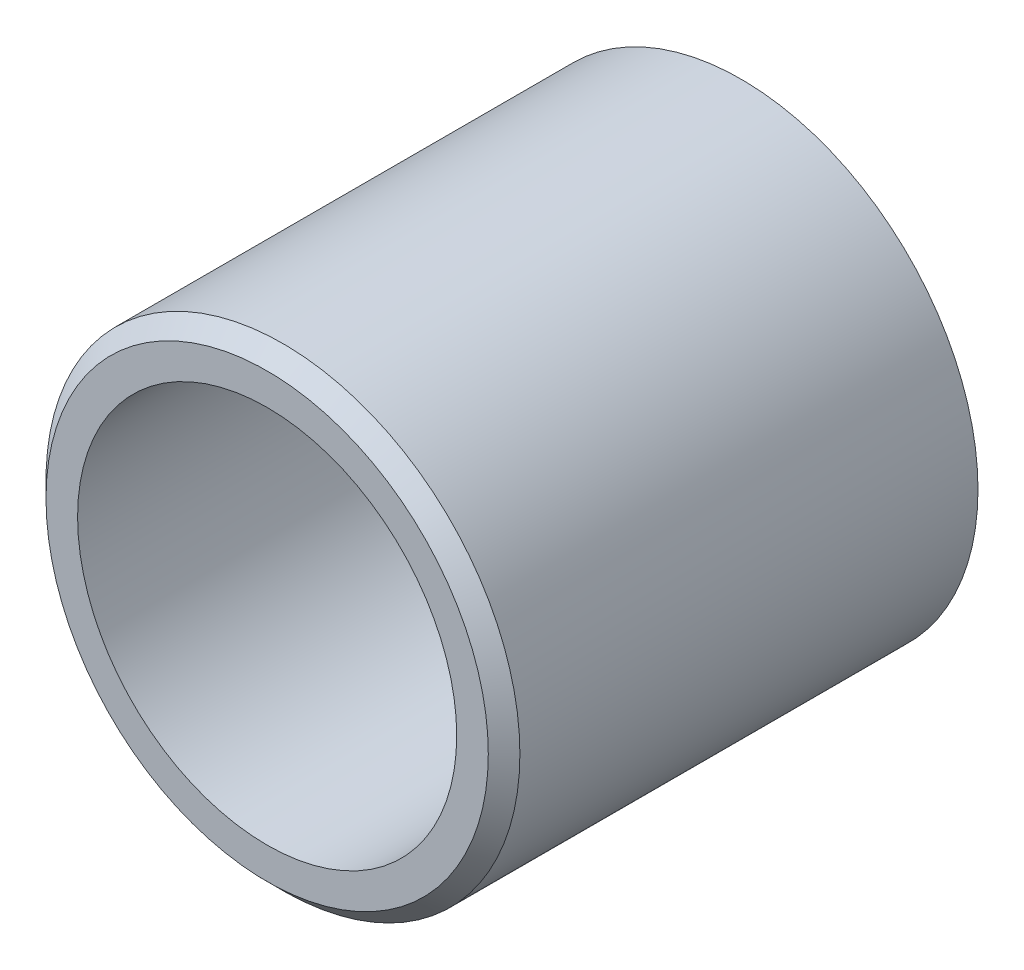
ISO-10303-21;
HEADER;
FILE_DESCRIPTION(('STEP AP214'),'2;1');
FILE_NAME('part.step','',(''),(''),'','','');
FILE_SCHEMA(('AUTOMOTIVE_DESIGN { 1 0 10303 214 1 1 1 1 }'));
ENDSEC;
DATA;
#1=APPLICATION_CONTEXT('core data for automotive mechanical design processes');
#2=APPLICATION_PROTOCOL_DEFINITION('international standard','automotive_design',2000,#1);
#3=PRODUCT_CONTEXT('',#1,'mechanical');
#4=PRODUCT('Part','Part','',(#3));
#5=PRODUCT_RELATED_PRODUCT_CATEGORY('part','',(#4));
#6=PRODUCT_DEFINITION_FORMATION('','',#4);
#7=PRODUCT_DEFINITION_CONTEXT('part definition',#1,'design');
#8=PRODUCT_DEFINITION('design','',#6,#7);
#9=PRODUCT_DEFINITION_SHAPE('','',#8);
#10=(LENGTH_UNIT() NAMED_UNIT(*) SI_UNIT(.MILLI.,.METRE.));
#11=(NAMED_UNIT(*) PLANE_ANGLE_UNIT() SI_UNIT($,.RADIAN.));
#12=(NAMED_UNIT(*) SI_UNIT($,.STERADIAN.) SOLID_ANGLE_UNIT());
#13=UNCERTAINTY_MEASURE_WITH_UNIT(LENGTH_MEASURE(1.E-05),#10,'distance_accuracy_value','');
#14=(GEOMETRIC_REPRESENTATION_CONTEXT(3) GLOBAL_UNCERTAINTY_ASSIGNED_CONTEXT((#13)) GLOBAL_UNIT_ASSIGNED_CONTEXT((#10,
#11,#12)) REPRESENTATION_CONTEXT('',''));
#15=CARTESIAN_POINT('',(0.,0.,0.));
#16=DIRECTION('',(0.,0.,1.));
#17=DIRECTION('',(1.,0.,0.));
#18=AXIS2_PLACEMENT_3D('',#15,#16,#17);
#19=CARTESIAN_POINT('',(0.,0.,9.85135401839912));
#20=DIRECTION('',(0.,0.,1.));
#21=DIRECTION('',(1.,0.,0.));
#22=AXIS2_PLACEMENT_3D('',#19,#20,#21);
#23=PLANE('',#22);
#24=CARTESIAN_POINT('',(0.,0.,9.85135401839912));
#25=DIRECTION('',(0.,0.,1.));
#26=DIRECTION('',(1.,0.,0.));
#27=AXIS2_PLACEMENT_3D('',#24,#25,#26);
#28=CIRCLE('',#27,2.22295652173);
#29=CARTESIAN_POINT('',(2.22295652173,0.,9.85135401839912));
#30=VERTEX_POINT('',#29);
#31=EDGE_CURVE('E48',#30,#30,#28,.T.);
#32=ORIENTED_EDGE('',*,*,#31,.T.);
#33=EDGE_LOOP('',(#32));
#34=FACE_BOUND('',#33,.T.);
#35=CARTESIAN_POINT('',(0.,0.,9.85135401839912));
#36=DIRECTION('',(0.,0.,1.));
#37=DIRECTION('',(1.,0.,0.));
#38=AXIS2_PLACEMENT_3D('',#35,#36,#37);
#39=CIRCLE('',#38,1.90539130434);
#40=CARTESIAN_POINT('',(1.90539130434,0.,9.85135401839912));
#41=VERTEX_POINT('',#40);
#42=EDGE_CURVE('E58',#41,#41,#39,.T.);
#43=ORIENTED_EDGE('',*,*,#42,.F.);
#44=EDGE_LOOP('',(#43));
#45=FACE_BOUND('',#44,.T.);
#46=ADVANCED_FACE('F40',(#34,#45),#23,.T.);
#47=CARTESIAN_POINT('',(0.,0.,5.08787575754912));
#48=DIRECTION('',(0.,0.,1.));
#49=DIRECTION('',(1.,0.,0.));
#50=AXIS2_PLACEMENT_3D('',#47,#48,#49);
#51=PLANE('',#50);
#52=CARTESIAN_POINT('',(0.,0.,5.08787575754912));
#53=DIRECTION('',(0.,0.,1.));
#54=DIRECTION('',(1.,0.,0.));
#55=AXIS2_PLACEMENT_3D('',#52,#53,#54);
#56=CIRCLE('',#55,2.381739130425);
#57=CARTESIAN_POINT('',(2.381739130425,0.,5.08787575754912));
#58=VERTEX_POINT('',#57);
#59=EDGE_CURVE('E53',#58,#58,#56,.T.);
#60=ORIENTED_EDGE('',*,*,#59,.F.);
#61=EDGE_LOOP('',(#60));
#62=FACE_BOUND('',#61,.T.);
#63=CARTESIAN_POINT('',(0.,0.,5.08787575754912));
#64=DIRECTION('',(0.,0.,1.));
#65=DIRECTION('',(1.,0.,0.));
#66=AXIS2_PLACEMENT_3D('',#63,#64,#65);
#67=CIRCLE('',#66,1.90539130434);
#68=CARTESIAN_POINT('',(1.90539130434,0.,5.08787575754912));
#69=VERTEX_POINT('',#68);
#70=EDGE_CURVE('E61',#69,#69,#67,.T.);
#71=ORIENTED_EDGE('',*,*,#70,.T.);
#72=EDGE_LOOP('',(#71));
#73=FACE_BOUND('',#72,.T.);
#74=ADVANCED_FACE('F73',(#62,#73),#51,.F.);
#75=CARTESIAN_POINT('',(0.,0.,9.85135401839912));
#76=DIRECTION('',(0.,0.,-1.));
#77=DIRECTION('',(-1.,0.,0.));
#78=AXIS2_PLACEMENT_3D('',#75,#76,#77);
#79=CYLINDRICAL_SURFACE('',#78,2.381739130425);
#80=CARTESIAN_POINT('',(0.,0.,9.69257140970412));
#81=DIRECTION('',(0.,0.,1.));
#82=DIRECTION('',(1.,0.,0.));
#83=AXIS2_PLACEMENT_3D('',#80,#81,#82);
#84=CIRCLE('',#83,2.381739130425);
#85=CARTESIAN_POINT('',(2.381739130425,0.,9.69257140970412));
#86=VERTEX_POINT('',#85);
#87=EDGE_CURVE('E10',#86,#86,#84,.F.);
#88=ORIENTED_EDGE('',*,*,#87,.T.);
#89=EDGE_LOOP('',(#88));
#90=FACE_BOUND('',#89,.T.);
#91=ORIENTED_EDGE('',*,*,#59,.T.);
#92=EDGE_LOOP('',(#91));
#93=FACE_BOUND('',#92,.T.);
#94=ADVANCED_FACE('F78',(#90,#93),#79,.T.);
#95=CARTESIAN_POINT('',(0.,0.,9.85135401839912));
#96=DIRECTION('',(0.,0.,-1.));
#97=DIRECTION('',(-1.,0.,0.));
#98=AXIS2_PLACEMENT_3D('',#95,#96,#97);
#99=CYLINDRICAL_SURFACE('',#98,1.90539130434);
#100=ORIENTED_EDGE('',*,*,#42,.T.);
#101=EDGE_LOOP('',(#100));
#102=FACE_BOUND('',#101,.T.);
#103=ORIENTED_EDGE('',*,*,#70,.F.);
#104=EDGE_LOOP('',(#103));
#105=FACE_BOUND('',#104,.T.);
#106=ADVANCED_FACE('F69',(#102,#105),#99,.F.);
#107=CARTESIAN_POINT('',(0.,0.,9.85135401839912));
#108=DIRECTION('',(0.,0.,-1.));
#109=DIRECTION('',(-1.,0.,0.));
#110=AXIS2_PLACEMENT_3D('',#107,#108,#109);
#111=CONICAL_SURFACE('',#110,2.22295652173,0.785398163397447);
#112=ORIENTED_EDGE('',*,*,#87,.F.);
#113=EDGE_LOOP('',(#112));
#114=FACE_BOUND('',#113,.T.);
#115=ORIENTED_EDGE('',*,*,#31,.F.);
#116=EDGE_LOOP('',(#115));
#117=FACE_BOUND('',#116,.T.);
#118=ADVANCED_FACE('F42',(#114,#117),#111,.T.);
#119=CLOSED_SHELL('',(#46,#74,#94,#106,#118));
#120=MANIFOLD_SOLID_BREP('B2',#119);
#121=ADVANCED_BREP_SHAPE_REPRESENTATION('',(#18,#120),#14);
#122=SHAPE_DEFINITION_REPRESENTATION(#9,#121);
ENDSEC;
END-ISO-10303-21;
